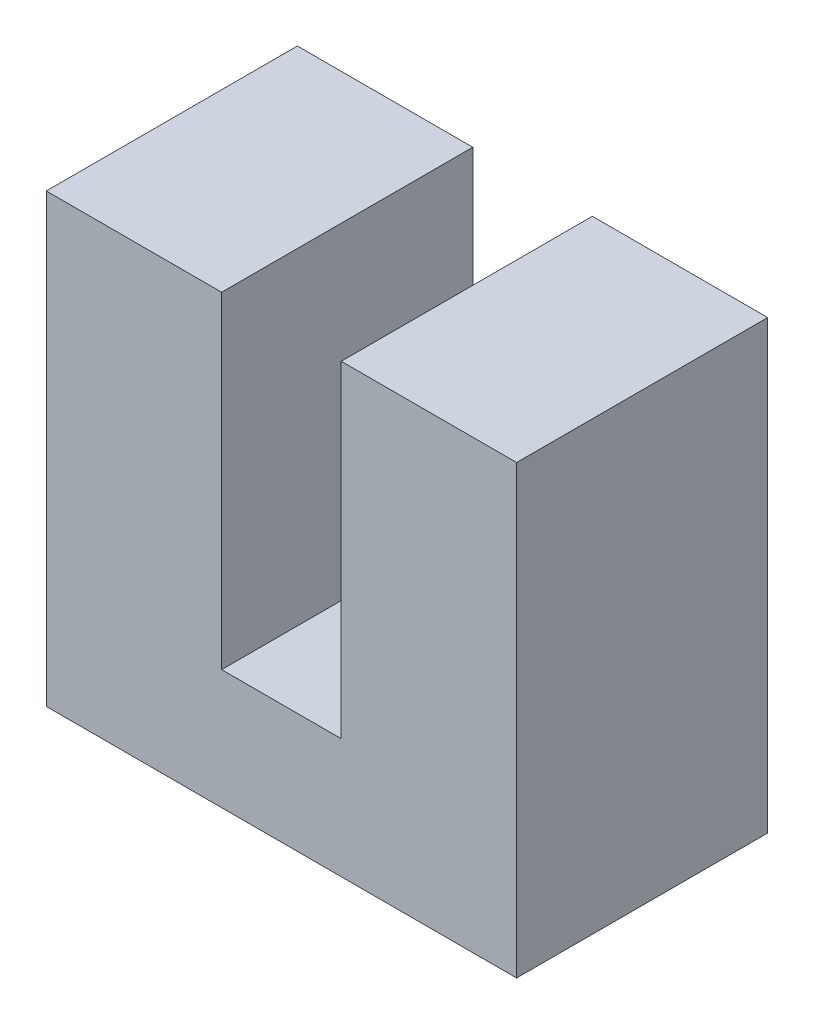
ISO-10303-21;
HEADER;
FILE_DESCRIPTION(('STEP AP214'),'2;1');
FILE_NAME('part.step','',(''),(''),'','','');
FILE_SCHEMA(('AUTOMOTIVE_DESIGN { 1 0 10303 214 1 1 1 1 }'));
ENDSEC;
DATA;
#1=APPLICATION_CONTEXT('core data for automotive mechanical design processes');
#2=APPLICATION_PROTOCOL_DEFINITION('international standard','automotive_design',2000,#1);
#3=PRODUCT_CONTEXT('',#1,'mechanical');
#4=PRODUCT('Part','Part','',(#3));
#5=PRODUCT_RELATED_PRODUCT_CATEGORY('part','',(#4));
#6=PRODUCT_DEFINITION_FORMATION('','',#4);
#7=PRODUCT_DEFINITION_CONTEXT('part definition',#1,'design');
#8=PRODUCT_DEFINITION('design','',#6,#7);
#9=PRODUCT_DEFINITION_SHAPE('','',#8);
#10=(LENGTH_UNIT() NAMED_UNIT(*) SI_UNIT(.MILLI.,.METRE.));
#11=(NAMED_UNIT(*) PLANE_ANGLE_UNIT() SI_UNIT($,.RADIAN.));
#12=(NAMED_UNIT(*) SI_UNIT($,.STERADIAN.) SOLID_ANGLE_UNIT());
#13=UNCERTAINTY_MEASURE_WITH_UNIT(LENGTH_MEASURE(1.E-05),#10,'distance_accuracy_value','');
#14=(GEOMETRIC_REPRESENTATION_CONTEXT(3) GLOBAL_UNCERTAINTY_ASSIGNED_CONTEXT((#13)) GLOBAL_UNIT_ASSIGNED_CONTEXT((#10,
#11,#12)) REPRESENTATION_CONTEXT('',''));
#15=CARTESIAN_POINT('',(0.,0.,0.));
#16=DIRECTION('',(0.,0.,1.));
#17=DIRECTION('',(1.,0.,0.));
#18=AXIS2_PLACEMENT_3D('',#15,#16,#17);
#19=CARTESIAN_POINT('',(0.,11.2,6.3));
#20=DIRECTION('',(1.,0.,0.));
#21=DIRECTION('',(0.,1.,0.));
#22=AXIS2_PLACEMENT_3D('',#19,#20,#21);
#23=PLANE('',#22);
#24=DIRECTION('',(0.,-1.,0.));
#25=VECTOR('',#24,1.);
#26=CARTESIAN_POINT('',(0.,11.2,0.));
#27=LINE('',#26,#25);
#28=CARTESIAN_POINT('',(0.,11.2,0.));
#29=VERTEX_POINT('',#28);
#30=CARTESIAN_POINT('',(0.,0.,0.));
#31=VERTEX_POINT('',#30);
#32=EDGE_CURVE('E127',#29,#31,#27,.T.);
#33=ORIENTED_EDGE('',*,*,#32,.T.);
#34=DIRECTION('',(0.,0.,-1.));
#35=VECTOR('',#34,1.);
#36=CARTESIAN_POINT('',(0.,0.,6.3));
#37=LINE('',#36,#35);
#38=CARTESIAN_POINT('',(0.,0.,6.3));
#39=VERTEX_POINT('',#38);
#40=EDGE_CURVE('E11',#39,#31,#37,.T.);
#41=ORIENTED_EDGE('',*,*,#40,.F.);
#42=DIRECTION('',(0.,-1.,0.));
#43=VECTOR('',#42,1.);
#44=CARTESIAN_POINT('',(0.,11.2,6.3));
#45=LINE('',#44,#43);
#46=CARTESIAN_POINT('',(0.,11.2,6.3));
#47=VERTEX_POINT('',#46);
#48=EDGE_CURVE('E141',#47,#39,#45,.T.);
#49=ORIENTED_EDGE('',*,*,#48,.F.);
#50=DIRECTION('',(0.,0.,-1.));
#51=VECTOR('',#50,1.);
#52=CARTESIAN_POINT('',(0.,11.2,6.3));
#53=LINE('',#52,#51);
#54=EDGE_CURVE('E123',#47,#29,#53,.T.);
#55=ORIENTED_EDGE('',*,*,#54,.T.);
#56=EDGE_LOOP('',(#33,#41,#49,#55));
#57=FACE_BOUND('',#56,.T.);
#58=ADVANCED_FACE('F31',(#57),#23,.F.);
#59=CARTESIAN_POINT('',(0.,0.,6.3));
#60=DIRECTION('',(0.,1.,0.));
#61=DIRECTION('',(0.,0.,1.));
#62=AXIS2_PLACEMENT_3D('',#59,#60,#61);
#63=PLANE('',#62);
#64=DIRECTION('',(1.,0.,0.));
#65=VECTOR('',#64,1.);
#66=CARTESIAN_POINT('',(0.,0.,0.));
#67=LINE('',#66,#65);
#68=CARTESIAN_POINT('',(11.8,0.,0.));
#69=VERTEX_POINT('',#68);
#70=EDGE_CURVE('E130',#31,#69,#67,.T.);
#71=ORIENTED_EDGE('',*,*,#70,.T.);
#72=DIRECTION('',(0.,0.,-1.));
#73=VECTOR('',#72,1.);
#74=CARTESIAN_POINT('',(11.8,0.,6.3));
#75=LINE('',#74,#73);
#76=CARTESIAN_POINT('',(11.8,0.,6.3));
#77=VERTEX_POINT('',#76);
#78=EDGE_CURVE('E39',#77,#69,#75,.T.);
#79=ORIENTED_EDGE('',*,*,#78,.F.);
#80=DIRECTION('',(1.,0.,0.));
#81=VECTOR('',#80,1.);
#82=CARTESIAN_POINT('',(0.,0.,6.3));
#83=LINE('',#82,#81);
#84=EDGE_CURVE('E90',#39,#77,#83,.T.);
#85=ORIENTED_EDGE('',*,*,#84,.F.);
#86=ORIENTED_EDGE('',*,*,#40,.T.);
#87=EDGE_LOOP('',(#71,#79,#85,#86));
#88=FACE_BOUND('',#87,.T.);
#89=ADVANCED_FACE('F176',(#88),#63,.F.);
#90=CARTESIAN_POINT('',(11.8,0.,6.3));
#91=DIRECTION('',(-1.,0.,0.));
#92=DIRECTION('',(0.,0.,1.));
#93=AXIS2_PLACEMENT_3D('',#90,#91,#92);
#94=PLANE('',#93);
#95=DIRECTION('',(0.,1.,0.));
#96=VECTOR('',#95,1.);
#97=CARTESIAN_POINT('',(11.8,0.,0.));
#98=LINE('',#97,#96);
#99=CARTESIAN_POINT('',(11.8,11.2,0.));
#100=VERTEX_POINT('',#99);
#101=EDGE_CURVE('E132',#69,#100,#98,.T.);
#102=ORIENTED_EDGE('',*,*,#101,.T.);
#103=DIRECTION('',(0.,0.,-1.));
#104=VECTOR('',#103,1.);
#105=CARTESIAN_POINT('',(11.8,11.2,6.3));
#106=LINE('',#105,#104);
#107=CARTESIAN_POINT('',(11.8,11.2,6.3));
#108=VERTEX_POINT('',#107);
#109=EDGE_CURVE('E148',#108,#100,#106,.T.);
#110=ORIENTED_EDGE('',*,*,#109,.F.);
#111=DIRECTION('',(0.,1.,0.));
#112=VECTOR('',#111,1.);
#113=CARTESIAN_POINT('',(11.8,0.,6.3));
#114=LINE('',#113,#112);
#115=EDGE_CURVE('E156',#77,#108,#114,.T.);
#116=ORIENTED_EDGE('',*,*,#115,.F.);
#117=ORIENTED_EDGE('',*,*,#78,.T.);
#118=EDGE_LOOP('',(#102,#110,#116,#117));
#119=FACE_BOUND('',#118,.T.);
#120=ADVANCED_FACE('F154',(#119),#94,.F.);
#121=CARTESIAN_POINT('',(11.8,11.2,6.3));
#122=DIRECTION('',(0.,-1.,0.));
#123=DIRECTION('',(0.,0.,-1.));
#124=AXIS2_PLACEMENT_3D('',#121,#122,#123);
#125=PLANE('',#124);
#126=DIRECTION('',(-1.,0.,0.));
#127=VECTOR('',#126,1.);
#128=CARTESIAN_POINT('',(11.8,11.2,0.));
#129=LINE('',#128,#127);
#130=CARTESIAN_POINT('',(7.4,11.2,0.));
#131=VERTEX_POINT('',#130);
#132=EDGE_CURVE('E134',#100,#131,#129,.T.);
#133=ORIENTED_EDGE('',*,*,#132,.T.);
#134=DIRECTION('',(0.,0.,-1.));
#135=VECTOR('',#134,1.);
#136=CARTESIAN_POINT('',(7.4,11.2,6.3));
#137=LINE('',#136,#135);
#138=CARTESIAN_POINT('',(7.4,11.2,6.3));
#139=VERTEX_POINT('',#138);
#140=EDGE_CURVE('E145',#139,#131,#137,.T.);
#141=ORIENTED_EDGE('',*,*,#140,.F.);
#142=DIRECTION('',(-1.,0.,0.));
#143=VECTOR('',#142,1.);
#144=CARTESIAN_POINT('',(11.8,11.2,6.3));
#145=LINE('',#144,#143);
#146=EDGE_CURVE('E168',#108,#139,#145,.T.);
#147=ORIENTED_EDGE('',*,*,#146,.F.);
#148=ORIENTED_EDGE('',*,*,#109,.T.);
#149=EDGE_LOOP('',(#133,#141,#147,#148));
#150=FACE_BOUND('',#149,.T.);
#151=ADVANCED_FACE('F164',(#150),#125,.F.);
#152=CARTESIAN_POINT('',(7.4,11.2,6.3));
#153=DIRECTION('',(1.,0.,0.));
#154=DIRECTION('',(0.,1.,0.));
#155=AXIS2_PLACEMENT_3D('',#152,#153,#154);
#156=PLANE('',#155);
#157=DIRECTION('',(0.,-1.,0.));
#158=VECTOR('',#157,1.);
#159=CARTESIAN_POINT('',(7.4,11.2,0.));
#160=LINE('',#159,#158);
#161=CARTESIAN_POINT('',(7.4,3.,0.));
#162=VERTEX_POINT('',#161);
#163=EDGE_CURVE('E136',#131,#162,#160,.T.);
#164=ORIENTED_EDGE('',*,*,#163,.T.);
#165=DIRECTION('',(0.,0.,-1.));
#166=VECTOR('',#165,1.);
#167=CARTESIAN_POINT('',(7.4,3.,6.3));
#168=LINE('',#167,#166);
#169=CARTESIAN_POINT('',(7.4,3.,6.3));
#170=VERTEX_POINT('',#169);
#171=EDGE_CURVE('E118',#170,#162,#168,.T.);
#172=ORIENTED_EDGE('',*,*,#171,.F.);
#173=DIRECTION('',(0.,-1.,0.));
#174=VECTOR('',#173,1.);
#175=CARTESIAN_POINT('',(7.4,11.2,6.3));
#176=LINE('',#175,#174);
#177=EDGE_CURVE('E109',#139,#170,#176,.T.);
#178=ORIENTED_EDGE('',*,*,#177,.F.);
#179=ORIENTED_EDGE('',*,*,#140,.T.);
#180=EDGE_LOOP('',(#164,#172,#178,#179));
#181=FACE_BOUND('',#180,.T.);
#182=ADVANCED_FACE('F167',(#181),#156,.F.);
#183=CARTESIAN_POINT('',(7.4,3.,6.3));
#184=DIRECTION('',(0.,-1.,0.));
#185=DIRECTION('',(1.,0.,0.));
#186=AXIS2_PLACEMENT_3D('',#183,#184,#185);
#187=PLANE('',#186);
#188=DIRECTION('',(-1.,0.,0.));
#189=VECTOR('',#188,1.);
#190=CARTESIAN_POINT('',(7.4,3.,0.));
#191=LINE('',#190,#189);
#192=CARTESIAN_POINT('',(4.4,3.,0.));
#193=VERTEX_POINT('',#192);
#194=EDGE_CURVE('E117',#162,#193,#191,.T.);
#195=ORIENTED_EDGE('',*,*,#194,.T.);
#196=DIRECTION('',(0.,0.,-1.));
#197=VECTOR('',#196,1.);
#198=CARTESIAN_POINT('',(4.4,3.,6.3));
#199=LINE('',#198,#197);
#200=CARTESIAN_POINT('',(4.4,3.,6.3));
#201=VERTEX_POINT('',#200);
#202=EDGE_CURVE('E114',#201,#193,#199,.T.);
#203=ORIENTED_EDGE('',*,*,#202,.F.);
#204=DIRECTION('',(-1.,0.,0.));
#205=VECTOR('',#204,1.);
#206=CARTESIAN_POINT('',(7.4,3.,6.3));
#207=LINE('',#206,#205);
#208=EDGE_CURVE('E103',#170,#201,#207,.T.);
#209=ORIENTED_EDGE('',*,*,#208,.F.);
#210=ORIENTED_EDGE('',*,*,#171,.T.);
#211=EDGE_LOOP('',(#195,#203,#209,#210));
#212=FACE_BOUND('',#211,.T.);
#213=ADVANCED_FACE('F115',(#212),#187,.F.);
#214=CARTESIAN_POINT('',(4.4,3.,6.3));
#215=DIRECTION('',(-1.,0.,0.));
#216=DIRECTION('',(0.,0.,1.));
#217=AXIS2_PLACEMENT_3D('',#214,#215,#216);
#218=PLANE('',#217);
#219=DIRECTION('',(0.,1.,0.));
#220=VECTOR('',#219,1.);
#221=CARTESIAN_POINT('',(4.4,3.,0.));
#222=LINE('',#221,#220);
#223=CARTESIAN_POINT('',(4.4,11.2,0.));
#224=VERTEX_POINT('',#223);
#225=EDGE_CURVE('E76',#193,#224,#222,.T.);
#226=ORIENTED_EDGE('',*,*,#225,.T.);
#227=DIRECTION('',(0.,0.,-1.));
#228=VECTOR('',#227,1.);
#229=CARTESIAN_POINT('',(4.4,11.2,6.3));
#230=LINE('',#229,#228);
#231=CARTESIAN_POINT('',(4.4,11.2,6.3));
#232=VERTEX_POINT('',#231);
#233=EDGE_CURVE('E119',#232,#224,#230,.T.);
#234=ORIENTED_EDGE('',*,*,#233,.F.);
#235=DIRECTION('',(0.,1.,0.));
#236=VECTOR('',#235,1.);
#237=CARTESIAN_POINT('',(4.4,3.,6.3));
#238=LINE('',#237,#236);
#239=EDGE_CURVE('E107',#201,#232,#238,.T.);
#240=ORIENTED_EDGE('',*,*,#239,.F.);
#241=ORIENTED_EDGE('',*,*,#202,.T.);
#242=EDGE_LOOP('',(#226,#234,#240,#241));
#243=FACE_BOUND('',#242,.T.);
#244=ADVANCED_FACE('F121',(#243),#218,.F.);
#245=CARTESIAN_POINT('',(4.4,11.2,6.3));
#246=DIRECTION('',(0.,-1.,0.));
#247=DIRECTION('',(0.,0.,-1.));
#248=AXIS2_PLACEMENT_3D('',#245,#246,#247);
#249=PLANE('',#248);
#250=DIRECTION('',(-1.,0.,0.));
#251=VECTOR('',#250,1.);
#252=CARTESIAN_POINT('',(4.4,11.2,0.));
#253=LINE('',#252,#251);
#254=EDGE_CURVE('E82',#224,#29,#253,.T.);
#255=ORIENTED_EDGE('',*,*,#254,.T.);
#256=ORIENTED_EDGE('',*,*,#54,.F.);
#257=DIRECTION('',(-1.,0.,0.));
#258=VECTOR('',#257,1.);
#259=CARTESIAN_POINT('',(4.4,11.2,6.3));
#260=LINE('',#259,#258);
#261=EDGE_CURVE('E47',#232,#47,#260,.T.);
#262=ORIENTED_EDGE('',*,*,#261,.F.);
#263=ORIENTED_EDGE('',*,*,#233,.T.);
#264=EDGE_LOOP('',(#255,#256,#262,#263));
#265=FACE_BOUND('',#264,.T.);
#266=ADVANCED_FACE('F192',(#265),#249,.F.);
#267=CARTESIAN_POINT('',(0.,0.,6.3));
#268=DIRECTION('',(0.,0.,1.));
#269=DIRECTION('',(1.,0.,0.));
#270=AXIS2_PLACEMENT_3D('',#267,#268,#269);
#271=PLANE('',#270);
#272=ORIENTED_EDGE('',*,*,#48,.T.);
#273=ORIENTED_EDGE('',*,*,#84,.T.);
#274=ORIENTED_EDGE('',*,*,#115,.T.);
#275=ORIENTED_EDGE('',*,*,#146,.T.);
#276=ORIENTED_EDGE('',*,*,#177,.T.);
#277=ORIENTED_EDGE('',*,*,#208,.T.);
#278=ORIENTED_EDGE('',*,*,#239,.T.);
#279=ORIENTED_EDGE('',*,*,#261,.T.);
#280=EDGE_LOOP('',(#272,#273,#274,#275,#276,#277,#278,#279));
#281=FACE_BOUND('',#280,.T.);
#282=ADVANCED_FACE('F105',(#281),#271,.T.);
#283=CARTESIAN_POINT('',(0.,0.,0.));
#284=DIRECTION('',(0.,0.,1.));
#285=DIRECTION('',(1.,0.,0.));
#286=AXIS2_PLACEMENT_3D('',#283,#284,#285);
#287=PLANE('',#286);
#288=ORIENTED_EDGE('',*,*,#32,.F.);
#289=ORIENTED_EDGE('',*,*,#254,.F.);
#290=ORIENTED_EDGE('',*,*,#225,.F.);
#291=ORIENTED_EDGE('',*,*,#194,.F.);
#292=ORIENTED_EDGE('',*,*,#163,.F.);
#293=ORIENTED_EDGE('',*,*,#132,.F.);
#294=ORIENTED_EDGE('',*,*,#101,.F.);
#295=ORIENTED_EDGE('',*,*,#70,.F.);
#296=EDGE_LOOP('',(#288,#289,#290,#291,#292,#293,#294,#295));
#297=FACE_BOUND('',#296,.T.);
#298=ADVANCED_FACE('F160',(#297),#287,.F.);
#299=CLOSED_SHELL('',(#58,#89,#120,#151,#182,#213,#244,#266,#282,#298));
#300=MANIFOLD_SOLID_BREP('B2',#299);
#301=ADVANCED_BREP_SHAPE_REPRESENTATION('',(#18,#300),#14);
#302=SHAPE_DEFINITION_REPRESENTATION(#9,#301);
ENDSEC;
END-ISO-10303-21;
